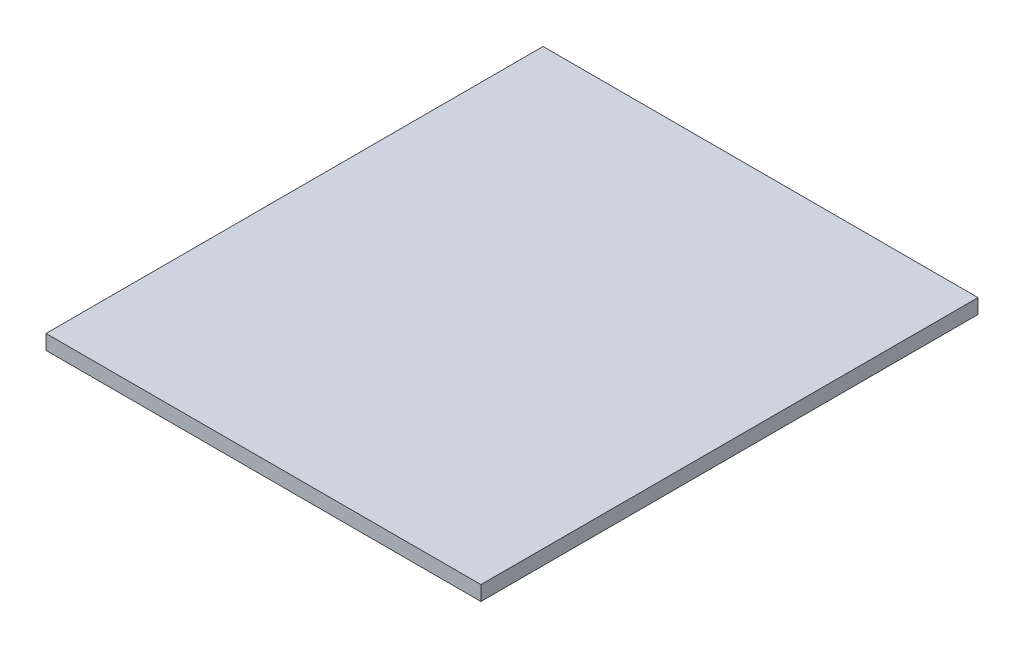
ISO-10303-21;
HEADER;
FILE_DESCRIPTION(('STEP AP214'),'2;1');
FILE_NAME('part.step','',(''),(''),'','','');
FILE_SCHEMA(('AUTOMOTIVE_DESIGN { 1 0 10303 214 1 1 1 1 }'));
ENDSEC;
DATA;
#1=APPLICATION_CONTEXT('core data for automotive mechanical design processes');
#2=APPLICATION_PROTOCOL_DEFINITION('international standard','automotive_design',2000,#1);
#3=PRODUCT_CONTEXT('',#1,'mechanical');
#4=PRODUCT('Part','Part','',(#3));
#5=PRODUCT_RELATED_PRODUCT_CATEGORY('part','',(#4));
#6=PRODUCT_DEFINITION_FORMATION('','',#4);
#7=PRODUCT_DEFINITION_CONTEXT('part definition',#1,'design');
#8=PRODUCT_DEFINITION('design','',#6,#7);
#9=PRODUCT_DEFINITION_SHAPE('','',#8);
#10=(LENGTH_UNIT() NAMED_UNIT(*) SI_UNIT(.MILLI.,.METRE.));
#11=(NAMED_UNIT(*) PLANE_ANGLE_UNIT() SI_UNIT($,.RADIAN.));
#12=(NAMED_UNIT(*) SI_UNIT($,.STERADIAN.) SOLID_ANGLE_UNIT());
#13=UNCERTAINTY_MEASURE_WITH_UNIT(LENGTH_MEASURE(1.E-05),#10,'distance_accuracy_value','');
#14=(GEOMETRIC_REPRESENTATION_CONTEXT(3) GLOBAL_UNCERTAINTY_ASSIGNED_CONTEXT((#13)) GLOBAL_UNIT_ASSIGNED_CONTEXT((#10,
#11,#12)) REPRESENTATION_CONTEXT('',''));
#15=CARTESIAN_POINT('',(0.,0.,0.));
#16=DIRECTION('',(0.,0.,1.));
#17=DIRECTION('',(1.,0.,0.));
#18=AXIS2_PLACEMENT_3D('',#15,#16,#17);
#19=CARTESIAN_POINT('',(-88.9,6.,101.6));
#20=DIRECTION('',(1.,0.,0.));
#21=DIRECTION('',(0.,0.,-1.));
#22=AXIS2_PLACEMENT_3D('',#19,#20,#21);
#23=PLANE('',#22);
#24=DIRECTION('',(0.,0.,1.));
#25=VECTOR('',#24,1.);
#26=CARTESIAN_POINT('',(-88.9,0.,101.6));
#27=LINE('',#26,#25);
#28=CARTESIAN_POINT('',(-88.9,0.,-101.6));
#29=VERTEX_POINT('',#28);
#30=CARTESIAN_POINT('',(-88.9,0.,101.6));
#31=VERTEX_POINT('',#30);
#32=EDGE_CURVE('E98',#29,#31,#27,.T.);
#33=ORIENTED_EDGE('',*,*,#32,.T.);
#34=DIRECTION('',(0.,-1.,0.));
#35=VECTOR('',#34,1.);
#36=CARTESIAN_POINT('',(-88.9,6.,101.6));
#37=LINE('',#36,#35);
#38=CARTESIAN_POINT('',(-88.9,6.,101.6));
#39=VERTEX_POINT('',#38);
#40=EDGE_CURVE('E11',#39,#31,#37,.T.);
#41=ORIENTED_EDGE('',*,*,#40,.F.);
#42=DIRECTION('',(0.,0.,1.));
#43=VECTOR('',#42,1.);
#44=CARTESIAN_POINT('',(-88.9,6.,101.6));
#45=LINE('',#44,#43);
#46=CARTESIAN_POINT('',(-88.9,6.,-101.6));
#47=VERTEX_POINT('',#46);
#48=EDGE_CURVE('E86',#47,#39,#45,.T.);
#49=ORIENTED_EDGE('',*,*,#48,.F.);
#50=DIRECTION('',(0.,-1.,0.));
#51=VECTOR('',#50,1.);
#52=CARTESIAN_POINT('',(-88.9,6.,-101.6));
#53=LINE('',#52,#51);
#54=EDGE_CURVE('E94',#47,#29,#53,.T.);
#55=ORIENTED_EDGE('',*,*,#54,.T.);
#56=EDGE_LOOP('',(#33,#41,#49,#55));
#57=FACE_BOUND('',#56,.T.);
#58=ADVANCED_FACE('F35',(#57),#23,.F.);
#59=CARTESIAN_POINT('',(88.9,6.,101.6));
#60=DIRECTION('',(0.,0.,-1.));
#61=DIRECTION('',(-1.,0.,0.));
#62=AXIS2_PLACEMENT_3D('',#59,#60,#61);
#63=PLANE('',#62);
#64=DIRECTION('',(1.,0.,0.));
#65=VECTOR('',#64,1.);
#66=CARTESIAN_POINT('',(88.9,0.,101.6));
#67=LINE('',#66,#65);
#68=CARTESIAN_POINT('',(88.9,0.,101.6));
#69=VERTEX_POINT('',#68);
#70=EDGE_CURVE('E90',#31,#69,#67,.T.);
#71=ORIENTED_EDGE('',*,*,#70,.T.);
#72=DIRECTION('',(0.,-1.,0.));
#73=VECTOR('',#72,1.);
#74=CARTESIAN_POINT('',(88.9,6.,101.6));
#75=LINE('',#74,#73);
#76=CARTESIAN_POINT('',(88.9,6.,101.6));
#77=VERTEX_POINT('',#76);
#78=EDGE_CURVE('E43',#77,#69,#75,.T.);
#79=ORIENTED_EDGE('',*,*,#78,.F.);
#80=DIRECTION('',(1.,0.,0.));
#81=VECTOR('',#80,1.);
#82=CARTESIAN_POINT('',(88.9,6.,101.6));
#83=LINE('',#82,#81);
#84=EDGE_CURVE('E81',#39,#77,#83,.T.);
#85=ORIENTED_EDGE('',*,*,#84,.F.);
#86=ORIENTED_EDGE('',*,*,#40,.T.);
#87=EDGE_LOOP('',(#71,#79,#85,#86));
#88=FACE_BOUND('',#87,.T.);
#89=ADVANCED_FACE('F89',(#88),#63,.F.);
#90=CARTESIAN_POINT('',(88.9,6.,101.6));
#91=DIRECTION('',(-1.,0.,0.));
#92=DIRECTION('',(0.,0.,1.));
#93=AXIS2_PLACEMENT_3D('',#90,#91,#92);
#94=PLANE('',#93);
#95=DIRECTION('',(0.,0.,-1.));
#96=VECTOR('',#95,1.);
#97=CARTESIAN_POINT('',(88.9,0.,101.6));
#98=LINE('',#97,#96);
#99=CARTESIAN_POINT('',(88.9,0.,-101.6));
#100=VERTEX_POINT('',#99);
#101=EDGE_CURVE('E68',#69,#100,#98,.T.);
#102=ORIENTED_EDGE('',*,*,#101,.T.);
#103=DIRECTION('',(0.,-1.,0.));
#104=VECTOR('',#103,1.);
#105=CARTESIAN_POINT('',(88.9,6.,-101.6));
#106=LINE('',#105,#104);
#107=CARTESIAN_POINT('',(88.9,6.,-101.6));
#108=VERTEX_POINT('',#107);
#109=EDGE_CURVE('E91',#108,#100,#106,.T.);
#110=ORIENTED_EDGE('',*,*,#109,.F.);
#111=DIRECTION('',(0.,0.,-1.));
#112=VECTOR('',#111,1.);
#113=CARTESIAN_POINT('',(88.9,6.,101.6));
#114=LINE('',#113,#112);
#115=EDGE_CURVE('E84',#77,#108,#114,.T.);
#116=ORIENTED_EDGE('',*,*,#115,.F.);
#117=ORIENTED_EDGE('',*,*,#78,.T.);
#118=EDGE_LOOP('',(#102,#110,#116,#117));
#119=FACE_BOUND('',#118,.T.);
#120=ADVANCED_FACE('F92',(#119),#94,.F.);
#121=CARTESIAN_POINT('',(88.9,6.,-101.6));
#122=DIRECTION('',(0.,0.,1.));
#123=DIRECTION('',(1.,0.,0.));
#124=AXIS2_PLACEMENT_3D('',#121,#122,#123);
#125=PLANE('',#124);
#126=DIRECTION('',(-1.,0.,0.));
#127=VECTOR('',#126,1.);
#128=CARTESIAN_POINT('',(88.9,0.,-101.6));
#129=LINE('',#128,#127);
#130=EDGE_CURVE('E74',#100,#29,#129,.T.);
#131=ORIENTED_EDGE('',*,*,#130,.T.);
#132=ORIENTED_EDGE('',*,*,#54,.F.);
#133=DIRECTION('',(-1.,0.,0.));
#134=VECTOR('',#133,1.);
#135=CARTESIAN_POINT('',(88.9,6.,-101.6));
#136=LINE('',#135,#134);
#137=EDGE_CURVE('E51',#108,#47,#136,.T.);
#138=ORIENTED_EDGE('',*,*,#137,.F.);
#139=ORIENTED_EDGE('',*,*,#109,.T.);
#140=EDGE_LOOP('',(#131,#132,#138,#139));
#141=FACE_BOUND('',#140,.T.);
#142=ADVANCED_FACE('F105',(#141),#125,.F.);
#143=CARTESIAN_POINT('',(0.,6.,0.));
#144=DIRECTION('',(0.,1.,0.));
#145=DIRECTION('',(0.,0.,1.));
#146=AXIS2_PLACEMENT_3D('',#143,#144,#145);
#147=PLANE('',#146);
#148=ORIENTED_EDGE('',*,*,#48,.T.);
#149=ORIENTED_EDGE('',*,*,#84,.T.);
#150=ORIENTED_EDGE('',*,*,#115,.T.);
#151=ORIENTED_EDGE('',*,*,#137,.T.);
#152=EDGE_LOOP('',(#148,#149,#150,#151));
#153=FACE_BOUND('',#152,.T.);
#154=ADVANCED_FACE('F82',(#153),#147,.T.);
#155=CARTESIAN_POINT('',(0.,0.,0.));
#156=DIRECTION('',(0.,1.,0.));
#157=DIRECTION('',(0.,0.,1.));
#158=AXIS2_PLACEMENT_3D('',#155,#156,#157);
#159=PLANE('',#158);
#160=ORIENTED_EDGE('',*,*,#32,.F.);
#161=ORIENTED_EDGE('',*,*,#130,.F.);
#162=ORIENTED_EDGE('',*,*,#101,.F.);
#163=ORIENTED_EDGE('',*,*,#70,.F.);
#164=EDGE_LOOP('',(#160,#161,#162,#163));
#165=FACE_BOUND('',#164,.T.);
#166=ADVANCED_FACE('F108',(#165),#159,.F.);
#167=CLOSED_SHELL('',(#58,#89,#120,#142,#154,#166));
#168=MANIFOLD_SOLID_BREP('B2',#167);
#169=ADVANCED_BREP_SHAPE_REPRESENTATION('',(#18,#168),#14);
#170=SHAPE_DEFINITION_REPRESENTATION(#9,#169);
ENDSEC;
END-ISO-10303-21;
